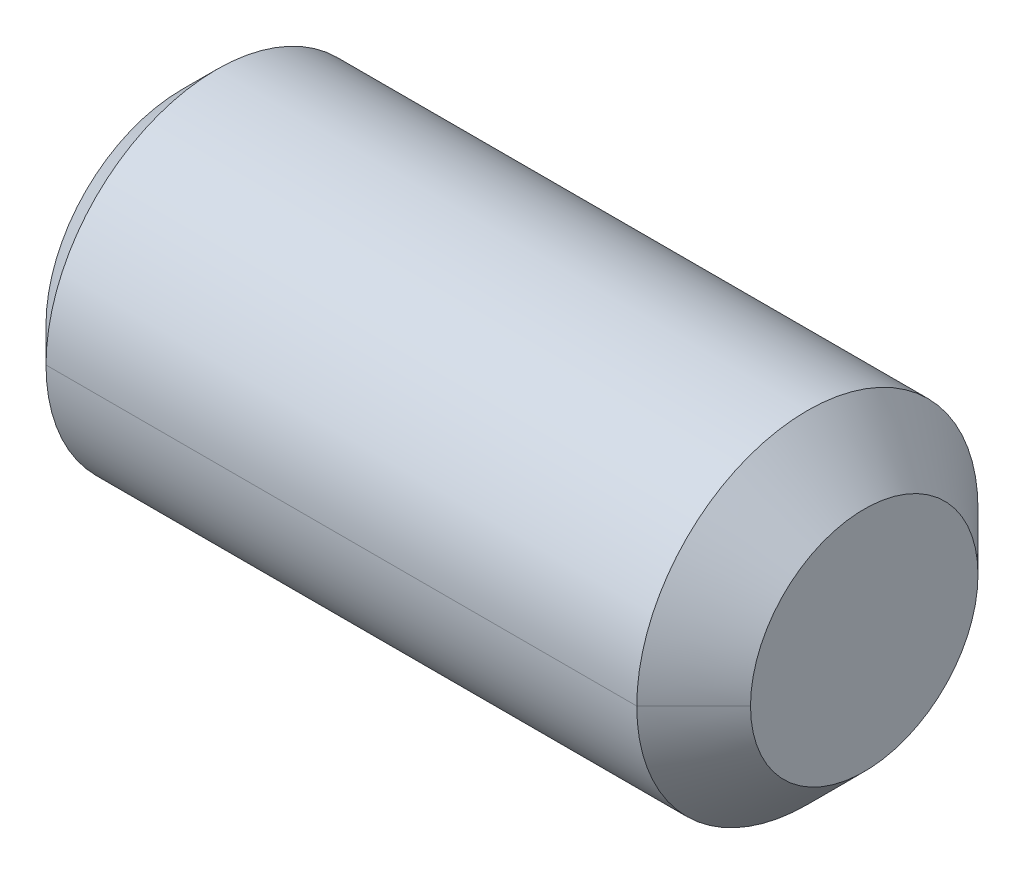
ISO-10303-21;
HEADER;
FILE_DESCRIPTION(('STEP AP214'),'2;1');
FILE_NAME('part.step','',(''),(''),'','','');
FILE_SCHEMA(('AUTOMOTIVE_DESIGN { 1 0 10303 214 1 1 1 1 }'));
ENDSEC;
DATA;
#1=APPLICATION_CONTEXT('core data for automotive mechanical design processes');
#2=APPLICATION_PROTOCOL_DEFINITION('international standard','automotive_design',2000,#1);
#3=PRODUCT_CONTEXT('',#1,'mechanical');
#4=PRODUCT('Part','Part','',(#3));
#5=PRODUCT_RELATED_PRODUCT_CATEGORY('part','',(#4));
#6=PRODUCT_DEFINITION_FORMATION('','',#4);
#7=PRODUCT_DEFINITION_CONTEXT('part definition',#1,'design');
#8=PRODUCT_DEFINITION('design','',#6,#7);
#9=PRODUCT_DEFINITION_SHAPE('','',#8);
#10=(LENGTH_UNIT() NAMED_UNIT(*) SI_UNIT(.MILLI.,.METRE.));
#11=(NAMED_UNIT(*) PLANE_ANGLE_UNIT() SI_UNIT($,.RADIAN.));
#12=(NAMED_UNIT(*) SI_UNIT($,.STERADIAN.) SOLID_ANGLE_UNIT());
#13=UNCERTAINTY_MEASURE_WITH_UNIT(LENGTH_MEASURE(1.E-05),#10,'distance_accuracy_value','');
#14=(GEOMETRIC_REPRESENTATION_CONTEXT(3) GLOBAL_UNCERTAINTY_ASSIGNED_CONTEXT((#13)) GLOBAL_UNIT_ASSIGNED_CONTEXT((#10,
#11,#12)) REPRESENTATION_CONTEXT('',''));
#15=CARTESIAN_POINT('',(0.,0.,0.));
#16=DIRECTION('',(0.,0.,1.));
#17=DIRECTION('',(1.,0.,0.));
#18=AXIS2_PLACEMENT_3D('',#15,#16,#17);
#19=CARTESIAN_POINT('',(-1.8,0.,0.));
#20=DIRECTION('',(-1.,0.,0.));
#21=DIRECTION('',(0.,1.,0.));
#22=AXIS2_PLACEMENT_3D('',#19,#20,#21);
#23=CONICAL_SURFACE('',#22,0.75,1.0471975512);
#24=CARTESIAN_POINT('',(-1.36698729811118,0.,0.));
#25=DIRECTION('',(-0.499999999997053,0.,-0.86602540378614));
#26=VECTOR('',#25,1.);
#27=LINE('',#24,#26);
#28=CARTESIAN_POINT('',(-1.3669872981078,0.,0.));
#29=VERTEX_POINT('',#28);
#30=CARTESIAN_POINT('',(-1.8,0.,-0.75));
#31=VERTEX_POINT('',#30);
#32=EDGE_CURVE('E10',#29,#31,#27,.T.);
#33=ORIENTED_EDGE('',*,*,#32,.T.);
#34=CARTESIAN_POINT('',(-1.8,0.,0.));
#35=DIRECTION('',(1.,0.,0.));
#36=DIRECTION('',(0.,0.,-1.));
#37=AXIS2_PLACEMENT_3D('',#34,#35,#36);
#38=CIRCLE('',#37,0.75);
#39=CARTESIAN_POINT('',(-1.8,-0.649519052838329,-0.375));
#40=VERTEX_POINT('',#39);
#41=EDGE_CURVE('E24',#40,#31,#38,.T.);
#42=ORIENTED_EDGE('',*,*,#41,.F.);
#43=CARTESIAN_POINT('',(-1.8,0.,0.));
#44=DIRECTION('',(1.,0.,0.));
#45=DIRECTION('',(0.,0.,-1.));
#46=AXIS2_PLACEMENT_3D('',#43,#44,#45);
#47=CIRCLE('',#46,0.75);
#48=CARTESIAN_POINT('',(-1.8,-0.649519052838329,0.375));
#49=VERTEX_POINT('',#48);
#50=EDGE_CURVE('E450',#49,#40,#47,.T.);
#51=ORIENTED_EDGE('',*,*,#50,.F.);
#52=CARTESIAN_POINT('',(-1.8,0.,0.));
#53=DIRECTION('',(1.,0.,0.));
#54=DIRECTION('',(0.,0.,-1.));
#55=AXIS2_PLACEMENT_3D('',#52,#53,#54);
#56=CIRCLE('',#55,0.75);
#57=CARTESIAN_POINT('',(-1.8,0.,0.75));
#58=VERTEX_POINT('',#57);
#59=EDGE_CURVE('E447',#58,#49,#56,.T.);
#60=ORIENTED_EDGE('',*,*,#59,.F.);
#61=CARTESIAN_POINT('',(-1.36698729811118,0.,0.));
#62=DIRECTION('',(-0.499999999997053,0.,0.86602540378614));
#63=VECTOR('',#62,1.);
#64=LINE('',#61,#63);
#65=EDGE_CURVE('E437',#29,#58,#64,.T.);
#66=ORIENTED_EDGE('',*,*,#65,.F.);
#67=EDGE_LOOP('',(#33,#42,#51,#60,#66));
#68=FACE_BOUND('',#67,.T.);
#69=ADVANCED_FACE('F16',(#68),#23,.F.);
#70=CARTESIAN_POINT('',(-1.8,0.,0.));
#71=DIRECTION('',(-1.,0.,0.));
#72=DIRECTION('',(0.,-1.,0.));
#73=AXIS2_PLACEMENT_3D('',#70,#71,#72);
#74=CONICAL_SURFACE('',#73,0.75,1.0471975512);
#75=ORIENTED_EDGE('',*,*,#65,.T.);
#76=CARTESIAN_POINT('',(-1.8,0.,0.));
#77=DIRECTION('',(1.,0.,0.));
#78=DIRECTION('',(0.,0.,-1.));
#79=AXIS2_PLACEMENT_3D('',#76,#77,#78);
#80=CIRCLE('',#79,0.75);
#81=CARTESIAN_POINT('',(-1.8,0.649519052838329,0.375));
#82=VERTEX_POINT('',#81);
#83=EDGE_CURVE('E489',#82,#58,#80,.T.);
#84=ORIENTED_EDGE('',*,*,#83,.F.);
#85=CARTESIAN_POINT('',(-1.8,0.,0.));
#86=DIRECTION('',(1.,0.,0.));
#87=DIRECTION('',(0.,0.,-1.));
#88=AXIS2_PLACEMENT_3D('',#85,#86,#87);
#89=CIRCLE('',#88,0.75);
#90=CARTESIAN_POINT('',(-1.8,0.64951905283833,-0.375000000000001));
#91=VERTEX_POINT('',#90);
#92=EDGE_CURVE('E492',#91,#82,#89,.T.);
#93=ORIENTED_EDGE('',*,*,#92,.F.);
#94=CARTESIAN_POINT('',(-1.8,0.,0.));
#95=DIRECTION('',(1.,0.,0.));
#96=DIRECTION('',(0.,0.,-1.));
#97=AXIS2_PLACEMENT_3D('',#94,#95,#96);
#98=CIRCLE('',#97,0.75);
#99=EDGE_CURVE('E403',#31,#91,#98,.T.);
#100=ORIENTED_EDGE('',*,*,#99,.F.);
#101=ORIENTED_EDGE('',*,*,#32,.F.);
#102=EDGE_LOOP('',(#75,#84,#93,#100,#101));
#103=FACE_BOUND('',#102,.T.);
#104=ADVANCED_FACE('F410',(#103),#74,.F.);
#105=CARTESIAN_POINT('',(-1.8,0.,0.));
#106=DIRECTION('',(1.,0.,0.));
#107=DIRECTION('',(0.,0.,-1.));
#108=AXIS2_PLACEMENT_3D('',#105,#106,#107);
#109=PLANE('',#108);
#110=ORIENTED_EDGE('',*,*,#99,.T.);
#111=DIRECTION('',(0.,0.500000000000001,0.866025403784438));
#112=VECTOR('',#111,1.);
#113=CARTESIAN_POINT('',(-1.8,0.43301270189222,-0.75));
#114=LINE('',#113,#112);
#115=CARTESIAN_POINT('',(-1.8,0.43301270189222,-0.75));
#116=VERTEX_POINT('',#115);
#117=EDGE_CURVE('E398',#116,#91,#114,.T.);
#118=ORIENTED_EDGE('',*,*,#117,.F.);
#119=DIRECTION('',(0.,1.,0.));
#120=VECTOR('',#119,1.);
#121=CARTESIAN_POINT('',(-1.8,-0.43301270189222,-0.75));
#122=LINE('',#121,#120);
#123=EDGE_CURVE('E393',#31,#116,#122,.T.);
#124=ORIENTED_EDGE('',*,*,#123,.F.);
#125=EDGE_LOOP('',(#110,#118,#124));
#126=FACE_BOUND('',#125,.T.);
#127=ADVANCED_FACE('F419',(#126),#109,.F.);
#128=CARTESIAN_POINT('',(-1.8,-0.43301270189222,-0.75));
#129=DIRECTION('',(0.,0.,1.));
#130=DIRECTION('',(1.,0.,0.));
#131=AXIS2_PLACEMENT_3D('',#128,#129,#130);
#132=PLANE('',#131);
#133=DIRECTION('',(0.,1.,0.));
#134=VECTOR('',#133,1.);
#135=CARTESIAN_POINT('',(-3.,-0.43301270189222,-0.75));
#136=LINE('',#135,#134);
#137=CARTESIAN_POINT('',(-3.,-0.43301270189222,-0.75));
#138=VERTEX_POINT('',#137);
#139=CARTESIAN_POINT('',(-3.,0.43301270189222,-0.75));
#140=VERTEX_POINT('',#139);
#141=EDGE_CURVE('E388',#138,#140,#136,.T.);
#142=ORIENTED_EDGE('',*,*,#141,.F.);
#143=DIRECTION('',(-1.,0.,0.));
#144=VECTOR('',#143,1.);
#145=CARTESIAN_POINT('',(-1.8,-0.43301270189222,-0.75));
#146=LINE('',#145,#144);
#147=CARTESIAN_POINT('',(-1.8,-0.43301270189222,-0.75));
#148=VERTEX_POINT('',#147);
#149=EDGE_CURVE('E383',#148,#138,#146,.T.);
#150=ORIENTED_EDGE('',*,*,#149,.F.);
#151=DIRECTION('',(0.,1.,0.));
#152=VECTOR('',#151,1.);
#153=CARTESIAN_POINT('',(-1.8,-0.43301270189222,-0.75));
#154=LINE('',#153,#152);
#155=EDGE_CURVE('E378',#148,#31,#154,.T.);
#156=ORIENTED_EDGE('',*,*,#155,.T.);
#157=ORIENTED_EDGE('',*,*,#123,.T.);
#158=DIRECTION('',(-1.,0.,0.));
#159=VECTOR('',#158,1.);
#160=CARTESIAN_POINT('',(-1.8,0.43301270189222,-0.75));
#161=LINE('',#160,#159);
#162=EDGE_CURVE('E374',#116,#140,#161,.T.);
#163=ORIENTED_EDGE('',*,*,#162,.T.);
#164=EDGE_LOOP('',(#142,#150,#156,#157,#163));
#165=FACE_BOUND('',#164,.T.);
#166=ADVANCED_FACE('F517',(#165),#132,.T.);
#167=CARTESIAN_POINT('',(-1.8,0.43301270189222,-0.75));
#168=DIRECTION('',(0.,-0.866025403784438,0.500000000000001));
#169=DIRECTION('',(0.,-0.500000000000001,-0.866025403784438));
#170=AXIS2_PLACEMENT_3D('',#167,#168,#169);
#171=PLANE('',#170);
#172=DIRECTION('',(0.,0.500000000000001,0.866025403784438));
#173=VECTOR('',#172,1.);
#174=CARTESIAN_POINT('',(-3.,0.43301270189222,-0.75));
#175=LINE('',#174,#173);
#176=CARTESIAN_POINT('',(-3.,0.86602540378444,0.));
#177=VERTEX_POINT('',#176);
#178=EDGE_CURVE('E369',#140,#177,#175,.T.);
#179=ORIENTED_EDGE('',*,*,#178,.F.);
#180=ORIENTED_EDGE('',*,*,#162,.F.);
#181=ORIENTED_EDGE('',*,*,#117,.T.);
#182=DIRECTION('',(0.,0.500000000000001,0.866025403784438));
#183=VECTOR('',#182,1.);
#184=CARTESIAN_POINT('',(-1.8,0.43301270189222,-0.75));
#185=LINE('',#184,#183);
#186=CARTESIAN_POINT('',(-1.8,0.86602540378444,0.));
#187=VERTEX_POINT('',#186);
#188=EDGE_CURVE('E365',#91,#187,#185,.T.);
#189=ORIENTED_EDGE('',*,*,#188,.T.);
#190=DIRECTION('',(-1.,0.,0.));
#191=VECTOR('',#190,1.);
#192=CARTESIAN_POINT('',(-1.8,0.86602540378444,0.));
#193=LINE('',#192,#191);
#194=EDGE_CURVE('E361',#187,#177,#193,.T.);
#195=ORIENTED_EDGE('',*,*,#194,.T.);
#196=EDGE_LOOP('',(#179,#180,#181,#189,#195));
#197=FACE_BOUND('',#196,.T.);
#198=ADVANCED_FACE('F505',(#197),#171,.T.);
#199=CARTESIAN_POINT('',(-1.8,0.86602540378444,0.));
#200=DIRECTION('',(0.,-0.866025403784438,-0.500000000000001));
#201=DIRECTION('',(0.,0.500000000000001,-0.866025403784438));
#202=AXIS2_PLACEMENT_3D('',#199,#200,#201);
#203=PLANE('',#202);
#204=DIRECTION('',(0.,-0.500000000000001,0.866025403784438));
#205=VECTOR('',#204,1.);
#206=CARTESIAN_POINT('',(-3.,0.86602540378444,0.));
#207=LINE('',#206,#205);
#208=CARTESIAN_POINT('',(-3.,0.43301270189222,0.75));
#209=VERTEX_POINT('',#208);
#210=EDGE_CURVE('E356',#177,#209,#207,.T.);
#211=ORIENTED_EDGE('',*,*,#210,.F.);
#212=ORIENTED_EDGE('',*,*,#194,.F.);
#213=DIRECTION('',(0.,-0.500000000000001,0.866025403784438));
#214=VECTOR('',#213,1.);
#215=CARTESIAN_POINT('',(-1.8,0.86602540378444,0.));
#216=LINE('',#215,#214);
#217=EDGE_CURVE('E351',#187,#82,#216,.T.);
#218=ORIENTED_EDGE('',*,*,#217,.T.);
#219=DIRECTION('',(0.,-0.500000000000001,0.866025403784438));
#220=VECTOR('',#219,1.);
#221=CARTESIAN_POINT('',(-1.8,0.86602540378444,0.));
#222=LINE('',#221,#220);
#223=CARTESIAN_POINT('',(-1.8,0.43301270189222,0.75));
#224=VERTEX_POINT('',#223);
#225=EDGE_CURVE('E347',#82,#224,#222,.T.);
#226=ORIENTED_EDGE('',*,*,#225,.T.);
#227=DIRECTION('',(-1.,0.,0.));
#228=VECTOR('',#227,1.);
#229=CARTESIAN_POINT('',(-1.8,0.43301270189222,0.75));
#230=LINE('',#229,#228);
#231=EDGE_CURVE('E343',#224,#209,#230,.T.);
#232=ORIENTED_EDGE('',*,*,#231,.T.);
#233=EDGE_LOOP('',(#211,#212,#218,#226,#232));
#234=FACE_BOUND('',#233,.T.);
#235=ADVANCED_FACE('F512',(#234),#203,.T.);
#236=CARTESIAN_POINT('',(-1.8,0.43301270189222,0.75));
#237=DIRECTION('',(0.,0.,-1.));
#238=DIRECTION('',(-1.,0.,0.));
#239=AXIS2_PLACEMENT_3D('',#236,#237,#238);
#240=PLANE('',#239);
#241=DIRECTION('',(0.,-1.,0.));
#242=VECTOR('',#241,1.);
#243=CARTESIAN_POINT('',(-3.,0.43301270189222,0.75));
#244=LINE('',#243,#242);
#245=CARTESIAN_POINT('',(-3.,-0.43301270189222,0.75));
#246=VERTEX_POINT('',#245);
#247=EDGE_CURVE('E338',#209,#246,#244,.T.);
#248=ORIENTED_EDGE('',*,*,#247,.F.);
#249=ORIENTED_EDGE('',*,*,#231,.F.);
#250=DIRECTION('',(0.,-1.,0.));
#251=VECTOR('',#250,1.);
#252=CARTESIAN_POINT('',(-1.8,0.43301270189222,0.75));
#253=LINE('',#252,#251);
#254=EDGE_CURVE('E333',#224,#58,#253,.T.);
#255=ORIENTED_EDGE('',*,*,#254,.T.);
#256=DIRECTION('',(0.,-1.,0.));
#257=VECTOR('',#256,1.);
#258=CARTESIAN_POINT('',(-1.8,0.43301270189222,0.75));
#259=LINE('',#258,#257);
#260=CARTESIAN_POINT('',(-1.8,-0.43301270189222,0.75));
#261=VERTEX_POINT('',#260);
#262=EDGE_CURVE('E329',#58,#261,#259,.T.);
#263=ORIENTED_EDGE('',*,*,#262,.T.);
#264=DIRECTION('',(-1.,0.,0.));
#265=VECTOR('',#264,1.);
#266=CARTESIAN_POINT('',(-1.8,-0.43301270189222,0.75));
#267=LINE('',#266,#265);
#268=EDGE_CURVE('E325',#261,#246,#267,.T.);
#269=ORIENTED_EDGE('',*,*,#268,.T.);
#270=EDGE_LOOP('',(#248,#249,#255,#263,#269));
#271=FACE_BOUND('',#270,.T.);
#272=ADVANCED_FACE('F520',(#271),#240,.T.);
#273=CARTESIAN_POINT('',(-1.8,-0.43301270189222,0.75));
#274=DIRECTION('',(0.,0.866025403784438,-0.500000000000001));
#275=DIRECTION('',(0.,0.500000000000001,0.866025403784438));
#276=AXIS2_PLACEMENT_3D('',#273,#274,#275);
#277=PLANE('',#276);
#278=DIRECTION('',(0.,-0.500000000000001,-0.866025403784438));
#279=VECTOR('',#278,1.);
#280=CARTESIAN_POINT('',(-3.,-0.43301270189222,0.75));
#281=LINE('',#280,#279);
#282=CARTESIAN_POINT('',(-3.,-0.86602540378444,0.));
#283=VERTEX_POINT('',#282);
#284=EDGE_CURVE('E320',#246,#283,#281,.T.);
#285=ORIENTED_EDGE('',*,*,#284,.F.);
#286=ORIENTED_EDGE('',*,*,#268,.F.);
#287=DIRECTION('',(0.,-0.500000000000001,-0.866025403784438));
#288=VECTOR('',#287,1.);
#289=CARTESIAN_POINT('',(-1.8,-0.43301270189222,0.75));
#290=LINE('',#289,#288);
#291=EDGE_CURVE('E315',#261,#49,#290,.T.);
#292=ORIENTED_EDGE('',*,*,#291,.T.);
#293=DIRECTION('',(0.,-0.500000000000001,-0.866025403784438));
#294=VECTOR('',#293,1.);
#295=CARTESIAN_POINT('',(-1.8,-0.43301270189222,0.75));
#296=LINE('',#295,#294);
#297=CARTESIAN_POINT('',(-1.8,-0.86602540378444,0.));
#298=VERTEX_POINT('',#297);
#299=EDGE_CURVE('E311',#49,#298,#296,.T.);
#300=ORIENTED_EDGE('',*,*,#299,.T.);
#301=DIRECTION('',(-1.,0.,0.));
#302=VECTOR('',#301,1.);
#303=CARTESIAN_POINT('',(-1.8,-0.86602540378444,0.));
#304=LINE('',#303,#302);
#305=EDGE_CURVE('E307',#298,#283,#304,.T.);
#306=ORIENTED_EDGE('',*,*,#305,.T.);
#307=EDGE_LOOP('',(#285,#286,#292,#300,#306));
#308=FACE_BOUND('',#307,.T.);
#309=ADVANCED_FACE('F479',(#308),#277,.T.);
#310=CARTESIAN_POINT('',(-1.8,-0.86602540378444,0.));
#311=DIRECTION('',(0.,0.866025403784438,0.500000000000001));
#312=DIRECTION('',(0.,-0.500000000000001,0.866025403784438));
#313=AXIS2_PLACEMENT_3D('',#310,#311,#312);
#314=PLANE('',#313);
#315=DIRECTION('',(0.,0.500000000000001,-0.866025403784438));
#316=VECTOR('',#315,1.);
#317=CARTESIAN_POINT('',(-3.,-0.86602540378444,0.));
#318=LINE('',#317,#316);
#319=EDGE_CURVE('E302',#283,#138,#318,.T.);
#320=ORIENTED_EDGE('',*,*,#319,.F.);
#321=ORIENTED_EDGE('',*,*,#305,.F.);
#322=DIRECTION('',(0.,0.500000000000001,-0.866025403784438));
#323=VECTOR('',#322,1.);
#324=CARTESIAN_POINT('',(-1.8,-0.86602540378444,0.));
#325=LINE('',#324,#323);
#326=EDGE_CURVE('E298',#298,#40,#325,.T.);
#327=ORIENTED_EDGE('',*,*,#326,.T.);
#328=DIRECTION('',(0.,0.500000000000001,-0.866025403784438));
#329=VECTOR('',#328,1.);
#330=CARTESIAN_POINT('',(-1.8,-0.86602540378444,0.));
#331=LINE('',#330,#329);
#332=EDGE_CURVE('E293',#40,#148,#331,.T.);
#333=ORIENTED_EDGE('',*,*,#332,.T.);
#334=ORIENTED_EDGE('',*,*,#149,.T.);
#335=EDGE_LOOP('',(#320,#321,#327,#333,#334));
#336=FACE_BOUND('',#335,.T.);
#337=ADVANCED_FACE('F518',(#336),#314,.T.);
#338=CARTESIAN_POINT('',(-1.8,0.,0.));
#339=DIRECTION('',(1.,0.,0.));
#340=DIRECTION('',(0.,0.,-1.));
#341=AXIS2_PLACEMENT_3D('',#338,#339,#340);
#342=PLANE('',#341);
#343=ORIENTED_EDGE('',*,*,#41,.T.);
#344=ORIENTED_EDGE('',*,*,#155,.F.);
#345=ORIENTED_EDGE('',*,*,#332,.F.);
#346=EDGE_LOOP('',(#343,#344,#345));
#347=FACE_BOUND('',#346,.T.);
#348=ADVANCED_FACE('F469',(#347),#342,.F.);
#349=CARTESIAN_POINT('',(-1.8,0.,0.));
#350=DIRECTION('',(1.,0.,0.));
#351=DIRECTION('',(0.,0.,-1.));
#352=AXIS2_PLACEMENT_3D('',#349,#350,#351);
#353=PLANE('',#352);
#354=ORIENTED_EDGE('',*,*,#50,.T.);
#355=ORIENTED_EDGE('',*,*,#326,.F.);
#356=ORIENTED_EDGE('',*,*,#299,.F.);
#357=EDGE_LOOP('',(#354,#355,#356));
#358=FACE_BOUND('',#357,.T.);
#359=ADVANCED_FACE('F474',(#358),#353,.F.);
#360=CARTESIAN_POINT('',(-3.,0.,0.));
#361=DIRECTION('',(1.,0.,0.));
#362=DIRECTION('',(0.,0.,-1.));
#363=AXIS2_PLACEMENT_3D('',#360,#361,#362);
#364=PLANE('',#363);
#365=CARTESIAN_POINT('',(-3.,0.,0.));
#366=DIRECTION('',(1.,0.,0.));
#367=DIRECTION('',(0.,0.,-1.));
#368=AXIS2_PLACEMENT_3D('',#365,#366,#367);
#369=CIRCLE('',#368,1.1935);
#370=CARTESIAN_POINT('',(-3.,0.,-1.1935));
#371=VERTEX_POINT('',#370);
#372=CARTESIAN_POINT('',(-3.,0.,1.1935));
#373=VERTEX_POINT('',#372);
#374=EDGE_CURVE('E289',#371,#373,#369,.T.);
#375=ORIENTED_EDGE('',*,*,#374,.F.);
#376=CARTESIAN_POINT('',(-3.,0.,0.));
#377=DIRECTION('',(1.,0.,0.));
#378=DIRECTION('',(0.,0.,-1.));
#379=AXIS2_PLACEMENT_3D('',#376,#377,#378);
#380=CIRCLE('',#379,1.1935);
#381=EDGE_CURVE('E287',#373,#371,#380,.T.);
#382=ORIENTED_EDGE('',*,*,#381,.F.);
#383=EDGE_LOOP('',(#375,#382));
#384=FACE_BOUND('',#383,.T.);
#385=ORIENTED_EDGE('',*,*,#247,.T.);
#386=ORIENTED_EDGE('',*,*,#284,.T.);
#387=ORIENTED_EDGE('',*,*,#319,.T.);
#388=ORIENTED_EDGE('',*,*,#141,.T.);
#389=ORIENTED_EDGE('',*,*,#178,.T.);
#390=ORIENTED_EDGE('',*,*,#210,.T.);
#391=EDGE_LOOP('',(#385,#386,#387,#388,#389,#390));
#392=FACE_BOUND('',#391,.T.);
#393=ADVANCED_FACE('F270',(#384,#392),#364,.F.);
#394=CARTESIAN_POINT('',(-3.,0.,0.));
#395=DIRECTION('',(1.,0.,0.));
#396=DIRECTION('',(0.,1.,0.));
#397=AXIS2_PLACEMENT_3D('',#394,#395,#396);
#398=CONICAL_SURFACE('',#397,1.1935,0.7853981634);
#399=ORIENTED_EDGE('',*,*,#381,.T.);
#400=CARTESIAN_POINT('',(-3.,0.,-1.1935));
#401=DIRECTION('',(0.707106781184743,0.,-0.707106781188352));
#402=VECTOR('',#401,1.);
#403=LINE('',#400,#402);
#404=CARTESIAN_POINT('',(-2.6935,0.,-1.5));
#405=VERTEX_POINT('',#404);
#406=EDGE_CURVE('E253',#371,#405,#403,.T.);
#407=ORIENTED_EDGE('',*,*,#406,.T.);
#408=CARTESIAN_POINT('',(-2.6935,0.,0.));
#409=DIRECTION('',(1.,0.,0.));
#410=DIRECTION('',(0.,0.,-1.));
#411=AXIS2_PLACEMENT_3D('',#408,#409,#410);
#412=CIRCLE('',#411,1.5);
#413=CARTESIAN_POINT('',(-2.6935,0.,1.5));
#414=VERTEX_POINT('',#413);
#415=EDGE_CURVE('E735',#414,#405,#412,.T.);
#416=ORIENTED_EDGE('',*,*,#415,.F.);
#417=CARTESIAN_POINT('',(-3.,0.,1.1935));
#418=DIRECTION('',(0.707106781184743,0.,0.707106781188352));
#419=VECTOR('',#418,1.);
#420=LINE('',#417,#419);
#421=EDGE_CURVE('E242',#373,#414,#420,.T.);
#422=ORIENTED_EDGE('',*,*,#421,.F.);
#423=EDGE_LOOP('',(#399,#407,#416,#422));
#424=FACE_BOUND('',#423,.T.);
#425=ADVANCED_FACE('F261',(#424),#398,.T.);
#426=CARTESIAN_POINT('',(-3.,0.,0.));
#427=DIRECTION('',(1.,0.,0.));
#428=DIRECTION('',(0.,-1.,0.));
#429=AXIS2_PLACEMENT_3D('',#426,#427,#428);
#430=CONICAL_SURFACE('',#429,1.1935,0.7853981634);
#431=CARTESIAN_POINT('',(-2.6935,0.,0.));
#432=DIRECTION('',(1.,0.,0.));
#433=DIRECTION('',(0.,0.,-1.));
#434=AXIS2_PLACEMENT_3D('',#431,#432,#433);
#435=CIRCLE('',#434,1.5);
#436=EDGE_CURVE('E225',#405,#414,#435,.T.);
#437=ORIENTED_EDGE('',*,*,#436,.F.);
#438=ORIENTED_EDGE('',*,*,#406,.F.);
#439=ORIENTED_EDGE('',*,*,#374,.T.);
#440=ORIENTED_EDGE('',*,*,#421,.T.);
#441=EDGE_LOOP('',(#437,#438,#439,#440));
#442=FACE_BOUND('',#441,.T.);
#443=ADVANCED_FACE('F209',(#442),#430,.T.);
#444=CARTESIAN_POINT('',(3.,0.,0.));
#445=DIRECTION('',(-1.,0.,0.));
#446=DIRECTION('',(0.,-1.,0.));
#447=AXIS2_PLACEMENT_3D('',#444,#445,#446);
#448=CYLINDRICAL_SURFACE('',#447,1.5);
#449=CARTESIAN_POINT('',(2.5,0.,0.));
#450=DIRECTION('',(1.,0.,0.));
#451=DIRECTION('',(0.,0.,-1.));
#452=AXIS2_PLACEMENT_3D('',#449,#450,#451);
#453=CIRCLE('',#452,1.5);
#454=CARTESIAN_POINT('',(2.5,0.,-1.5));
#455=VERTEX_POINT('',#454);
#456=CARTESIAN_POINT('',(2.5,0.,1.5));
#457=VERTEX_POINT('',#456);
#458=EDGE_CURVE('E128',#455,#457,#453,.T.);
#459=ORIENTED_EDGE('',*,*,#458,.F.);
#460=CARTESIAN_POINT('',(2.5,0.,-1.5));
#461=DIRECTION('',(-1.,0.,0.));
#462=VECTOR('',#461,1.);
#463=LINE('',#460,#462);
#464=EDGE_CURVE('E195',#455,#405,#463,.T.);
#465=ORIENTED_EDGE('',*,*,#464,.T.);
#466=ORIENTED_EDGE('',*,*,#436,.T.);
#467=CARTESIAN_POINT('',(2.5,0.,1.5));
#468=DIRECTION('',(-1.,0.,0.));
#469=VECTOR('',#468,1.);
#470=LINE('',#467,#469);
#471=EDGE_CURVE('E179',#457,#414,#470,.T.);
#472=ORIENTED_EDGE('',*,*,#471,.F.);
#473=EDGE_LOOP('',(#459,#465,#466,#472));
#474=FACE_BOUND('',#473,.T.);
#475=ADVANCED_FACE('F200',(#474),#448,.T.);
#476=CARTESIAN_POINT('',(3.,0.,0.));
#477=DIRECTION('',(-1.,0.,0.));
#478=DIRECTION('',(0.,1.,0.));
#479=AXIS2_PLACEMENT_3D('',#476,#477,#478);
#480=CYLINDRICAL_SURFACE('',#479,1.5);
#481=ORIENTED_EDGE('',*,*,#415,.T.);
#482=ORIENTED_EDGE('',*,*,#464,.F.);
#483=CARTESIAN_POINT('',(2.5,0.,0.));
#484=DIRECTION('',(1.,0.,0.));
#485=DIRECTION('',(0.,0.,-1.));
#486=AXIS2_PLACEMENT_3D('',#483,#484,#485);
#487=CIRCLE('',#486,1.5);
#488=EDGE_CURVE('E180',#457,#455,#487,.T.);
#489=ORIENTED_EDGE('',*,*,#488,.F.);
#490=ORIENTED_EDGE('',*,*,#471,.T.);
#491=EDGE_LOOP('',(#481,#482,#489,#490));
#492=FACE_BOUND('',#491,.T.);
#493=ADVANCED_FACE('F149',(#492),#480,.T.);
#494=CARTESIAN_POINT('',(2.5,0.,0.));
#495=DIRECTION('',(-1.,0.,0.));
#496=DIRECTION('',(0.,1.,0.));
#497=AXIS2_PLACEMENT_3D('',#494,#495,#496);
#498=CONICAL_SURFACE('',#497,1.5,0.7853981634);
#499=ORIENTED_EDGE('',*,*,#488,.T.);
#500=CARTESIAN_POINT('',(2.99999999999872,0.,-0.999999999998724));
#501=DIRECTION('',(-0.707106781184743,0.,-0.707106781188352));
#502=VECTOR('',#501,1.);
#503=LINE('',#500,#502);
#504=CARTESIAN_POINT('',(3.,0.,-1.));
#505=VERTEX_POINT('',#504);
#506=EDGE_CURVE('E118',#505,#455,#503,.T.);
#507=ORIENTED_EDGE('',*,*,#506,.F.);
#508=CARTESIAN_POINT('',(3.,0.,0.));
#509=DIRECTION('',(1.,0.,0.));
#510=DIRECTION('',(0.,0.,-1.));
#511=AXIS2_PLACEMENT_3D('',#508,#509,#510);
#512=CIRCLE('',#511,1.);
#513=CARTESIAN_POINT('',(2.99999999999872,0.,0.999999999998724));
#514=VERTEX_POINT('',#513);
#515=EDGE_CURVE('E110',#514,#505,#512,.T.);
#516=ORIENTED_EDGE('',*,*,#515,.F.);
#517=CARTESIAN_POINT('',(2.99999999999872,0.,0.999999999998724));
#518=DIRECTION('',(-0.707106781184743,0.,0.707106781188352));
#519=VECTOR('',#518,1.);
#520=LINE('',#517,#519);
#521=EDGE_CURVE('E114',#514,#457,#520,.T.);
#522=ORIENTED_EDGE('',*,*,#521,.T.);
#523=EDGE_LOOP('',(#499,#507,#516,#522));
#524=FACE_BOUND('',#523,.T.);
#525=ADVANCED_FACE('F113',(#524),#498,.T.);
#526=CARTESIAN_POINT('',(2.5,0.,0.));
#527=DIRECTION('',(-1.,0.,0.));
#528=DIRECTION('',(0.,-1.,0.));
#529=AXIS2_PLACEMENT_3D('',#526,#527,#528);
#530=CONICAL_SURFACE('',#529,1.5,0.7853981634);
#531=CARTESIAN_POINT('',(3.,0.,0.));
#532=DIRECTION('',(1.,0.,0.));
#533=DIRECTION('',(0.,0.,-1.));
#534=AXIS2_PLACEMENT_3D('',#531,#532,#533);
#535=CIRCLE('',#534,1.);
#536=EDGE_CURVE('E127',#505,#514,#535,.T.);
#537=ORIENTED_EDGE('',*,*,#536,.F.);
#538=ORIENTED_EDGE('',*,*,#506,.T.);
#539=ORIENTED_EDGE('',*,*,#458,.T.);
#540=ORIENTED_EDGE('',*,*,#521,.F.);
#541=EDGE_LOOP('',(#537,#538,#539,#540));
#542=FACE_BOUND('',#541,.T.);
#543=ADVANCED_FACE('F126',(#542),#530,.T.);
#544=CARTESIAN_POINT('',(3.,1.,0.));
#545=DIRECTION('',(-1.,0.,0.));
#546=DIRECTION('',(0.,0.,1.));
#547=AXIS2_PLACEMENT_3D('',#544,#545,#546);
#548=PLANE('',#547);
#549=ORIENTED_EDGE('',*,*,#536,.T.);
#550=ORIENTED_EDGE('',*,*,#515,.T.);
#551=EDGE_LOOP('',(#549,#550));
#552=FACE_BOUND('',#551,.T.);
#553=ADVANCED_FACE('F131',(#552),#548,.F.);
#554=CARTESIAN_POINT('',(-1.8,0.,0.));
#555=DIRECTION('',(1.,0.,0.));
#556=DIRECTION('',(0.,0.,-1.));
#557=AXIS2_PLACEMENT_3D('',#554,#555,#556);
#558=PLANE('',#557);
#559=ORIENTED_EDGE('',*,*,#59,.T.);
#560=ORIENTED_EDGE('',*,*,#291,.F.);
#561=ORIENTED_EDGE('',*,*,#262,.F.);
#562=EDGE_LOOP('',(#559,#560,#561));
#563=FACE_BOUND('',#562,.T.);
#564=ADVANCED_FACE('F483',(#563),#558,.F.);
#565=CARTESIAN_POINT('',(-1.8,0.,0.));
#566=DIRECTION('',(1.,0.,0.));
#567=DIRECTION('',(0.,0.,-1.));
#568=AXIS2_PLACEMENT_3D('',#565,#566,#567);
#569=PLANE('',#568);
#570=ORIENTED_EDGE('',*,*,#83,.T.);
#571=ORIENTED_EDGE('',*,*,#254,.F.);
#572=ORIENTED_EDGE('',*,*,#225,.F.);
#573=EDGE_LOOP('',(#570,#571,#572));
#574=FACE_BOUND('',#573,.T.);
#575=ADVANCED_FACE('F490',(#574),#569,.F.);
#576=CARTESIAN_POINT('',(-1.8,0.,0.));
#577=DIRECTION('',(1.,0.,0.));
#578=DIRECTION('',(0.,0.,-1.));
#579=AXIS2_PLACEMENT_3D('',#576,#577,#578);
#580=PLANE('',#579);
#581=ORIENTED_EDGE('',*,*,#92,.T.);
#582=ORIENTED_EDGE('',*,*,#217,.F.);
#583=ORIENTED_EDGE('',*,*,#188,.F.);
#584=EDGE_LOOP('',(#581,#582,#583));
#585=FACE_BOUND('',#584,.T.);
#586=ADVANCED_FACE('F509',(#585),#580,.F.);
#587=CLOSED_SHELL('',(#69,#104,#127,#166,#198,#235,#272,#309,#337,#348,#359,#393,#425,#443,#475,
#493,#525,#543,#553,#564,#575,#586));
#588=MANIFOLD_SOLID_BREP('B1',#587);
#589=ADVANCED_BREP_SHAPE_REPRESENTATION('',(#18,#588),#14);
#590=SHAPE_DEFINITION_REPRESENTATION(#9,#589);
ENDSEC;
END-ISO-10303-21;
